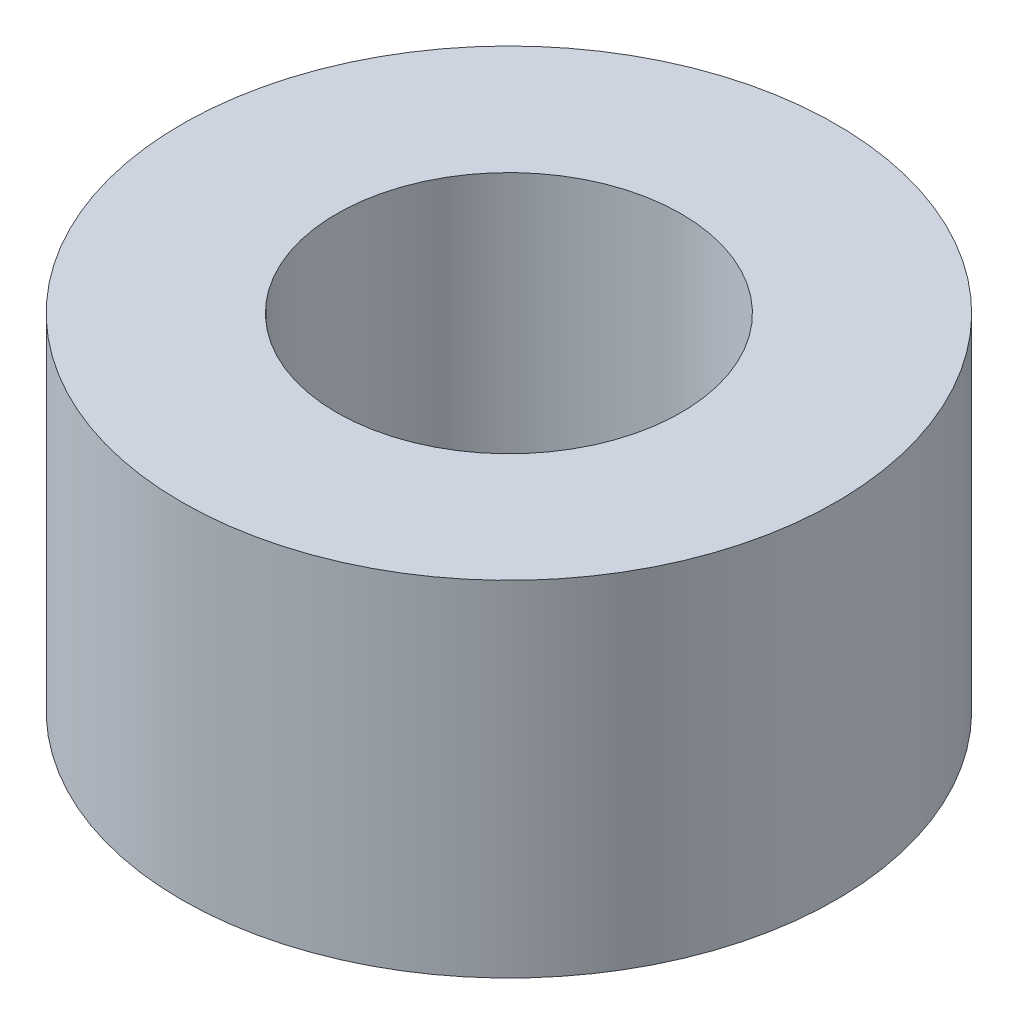
ISO-10303-21;
HEADER;
FILE_DESCRIPTION(('STEP AP214'),'2;1');
FILE_NAME('part.step','',(''),(''),'','','');
FILE_SCHEMA(('AUTOMOTIVE_DESIGN { 1 0 10303 214 1 1 1 1 }'));
ENDSEC;
DATA;
#1=APPLICATION_CONTEXT('core data for automotive mechanical design processes');
#2=APPLICATION_PROTOCOL_DEFINITION('international standard','automotive_design',2000,#1);
#3=PRODUCT_CONTEXT('',#1,'mechanical');
#4=PRODUCT('Part','Part','',(#3));
#5=PRODUCT_RELATED_PRODUCT_CATEGORY('part','',(#4));
#6=PRODUCT_DEFINITION_FORMATION('','',#4);
#7=PRODUCT_DEFINITION_CONTEXT('part definition',#1,'design');
#8=PRODUCT_DEFINITION('design','',#6,#7);
#9=PRODUCT_DEFINITION_SHAPE('','',#8);
#10=(LENGTH_UNIT() NAMED_UNIT(*) SI_UNIT(.MILLI.,.METRE.));
#11=(NAMED_UNIT(*) PLANE_ANGLE_UNIT() SI_UNIT($,.RADIAN.));
#12=(NAMED_UNIT(*) SI_UNIT($,.STERADIAN.) SOLID_ANGLE_UNIT());
#13=UNCERTAINTY_MEASURE_WITH_UNIT(LENGTH_MEASURE(1.E-05),#10,'distance_accuracy_value','');
#14=(GEOMETRIC_REPRESENTATION_CONTEXT(3) GLOBAL_UNCERTAINTY_ASSIGNED_CONTEXT((#13)) GLOBAL_UNIT_ASSIGNED_CONTEXT((#10,
#11,#12)) REPRESENTATION_CONTEXT('',''));
#15=CARTESIAN_POINT('',(0.,0.,0.));
#16=DIRECTION('',(0.,0.,1.));
#17=DIRECTION('',(1.,0.,0.));
#18=AXIS2_PLACEMENT_3D('',#15,#16,#17);
#19=CARTESIAN_POINT('',(0.,10.,0.));
#20=DIRECTION('',(0.,1.,0.));
#21=DIRECTION('',(0.,0.,1.));
#22=AXIS2_PLACEMENT_3D('',#19,#20,#21);
#23=PLANE('',#22);
#24=CARTESIAN_POINT('',(0.,10.,0.));
#25=DIRECTION('',(0.,1.,0.));
#26=DIRECTION('',(0.,0.,1.));
#27=AXIS2_PLACEMENT_3D('',#24,#25,#26);
#28=CIRCLE('',#27,9.5);
#29=CARTESIAN_POINT('',(0.,10.,9.5));
#30=VERTEX_POINT('',#29);
#31=EDGE_CURVE('E10',#30,#30,#28,.T.);
#32=ORIENTED_EDGE('',*,*,#31,.T.);
#33=EDGE_LOOP('',(#32));
#34=FACE_BOUND('',#33,.T.);
#35=CARTESIAN_POINT('',(0.,10.,0.));
#36=DIRECTION('',(0.,1.,0.));
#37=DIRECTION('',(0.,0.,1.));
#38=AXIS2_PLACEMENT_3D('',#35,#36,#37);
#39=CIRCLE('',#38,5.);
#40=CARTESIAN_POINT('',(0.,10.,5.));
#41=VERTEX_POINT('',#40);
#42=EDGE_CURVE('E44',#41,#41,#39,.T.);
#43=ORIENTED_EDGE('',*,*,#42,.F.);
#44=EDGE_LOOP('',(#43));
#45=FACE_BOUND('',#44,.T.);
#46=ADVANCED_FACE('F33',(#34,#45),#23,.T.);
#47=CARTESIAN_POINT('',(0.,0.,0.));
#48=DIRECTION('',(0.,1.,0.));
#49=DIRECTION('',(0.,0.,1.));
#50=AXIS2_PLACEMENT_3D('',#47,#48,#49);
#51=PLANE('',#50);
#52=CARTESIAN_POINT('',(0.,0.,0.));
#53=DIRECTION('',(0.,1.,0.));
#54=DIRECTION('',(0.,0.,1.));
#55=AXIS2_PLACEMENT_3D('',#52,#53,#54);
#56=CIRCLE('',#55,9.5);
#57=CARTESIAN_POINT('',(0.,0.,9.5));
#58=VERTEX_POINT('',#57);
#59=EDGE_CURVE('E37',#58,#58,#56,.T.);
#60=ORIENTED_EDGE('',*,*,#59,.F.);
#61=EDGE_LOOP('',(#60));
#62=FACE_BOUND('',#61,.T.);
#63=CARTESIAN_POINT('',(0.,0.,0.));
#64=DIRECTION('',(0.,1.,0.));
#65=DIRECTION('',(0.,0.,1.));
#66=AXIS2_PLACEMENT_3D('',#63,#64,#65);
#67=CIRCLE('',#66,5.);
#68=CARTESIAN_POINT('',(0.,0.,5.));
#69=VERTEX_POINT('',#68);
#70=EDGE_CURVE('E46',#69,#69,#67,.T.);
#71=ORIENTED_EDGE('',*,*,#70,.T.);
#72=EDGE_LOOP('',(#71));
#73=FACE_BOUND('',#72,.T.);
#74=ADVANCED_FACE('F56',(#62,#73),#51,.F.);
#75=CARTESIAN_POINT('',(0.,10.,0.));
#76=DIRECTION('',(0.,-1.,0.));
#77=DIRECTION('',(0.,0.,-1.));
#78=AXIS2_PLACEMENT_3D('',#75,#76,#77);
#79=CYLINDRICAL_SURFACE('',#78,9.5);
#80=ORIENTED_EDGE('',*,*,#31,.F.);
#81=EDGE_LOOP('',(#80));
#82=FACE_BOUND('',#81,.T.);
#83=ORIENTED_EDGE('',*,*,#59,.T.);
#84=EDGE_LOOP('',(#83));
#85=FACE_BOUND('',#84,.T.);
#86=ADVANCED_FACE('F35',(#82,#85),#79,.T.);
#87=CARTESIAN_POINT('',(0.,10.,0.));
#88=DIRECTION('',(0.,-1.,0.));
#89=DIRECTION('',(0.,0.,-1.));
#90=AXIS2_PLACEMENT_3D('',#87,#88,#89);
#91=CYLINDRICAL_SURFACE('',#90,5.);
#92=ORIENTED_EDGE('',*,*,#42,.T.);
#93=EDGE_LOOP('',(#92));
#94=FACE_BOUND('',#93,.T.);
#95=ORIENTED_EDGE('',*,*,#70,.F.);
#96=EDGE_LOOP('',(#95));
#97=FACE_BOUND('',#96,.T.);
#98=ADVANCED_FACE('F52',(#94,#97),#91,.F.);
#99=CLOSED_SHELL('',(#46,#74,#86,#98));
#100=MANIFOLD_SOLID_BREP('B2',#99);
#101=ADVANCED_BREP_SHAPE_REPRESENTATION('',(#18,#100),#14);
#102=SHAPE_DEFINITION_REPRESENTATION(#9,#101);
ENDSEC;
END-ISO-10303-21;
